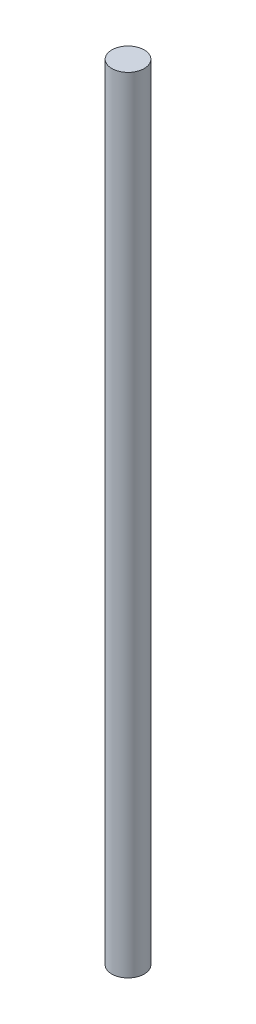
ISO-10303-21;
HEADER;
FILE_DESCRIPTION(('STEP AP214'),'2;1');
FILE_NAME('part.step','',(''),(''),'','','');
FILE_SCHEMA(('AUTOMOTIVE_DESIGN { 1 0 10303 214 1 1 1 1 }'));
ENDSEC;
DATA;
#1=APPLICATION_CONTEXT('core data for automotive mechanical design processes');
#2=APPLICATION_PROTOCOL_DEFINITION('international standard','automotive_design',2000,#1);
#3=PRODUCT_CONTEXT('',#1,'mechanical');
#4=PRODUCT('Part','Part','',(#3));
#5=PRODUCT_RELATED_PRODUCT_CATEGORY('part','',(#4));
#6=PRODUCT_DEFINITION_FORMATION('','',#4);
#7=PRODUCT_DEFINITION_CONTEXT('part definition',#1,'design');
#8=PRODUCT_DEFINITION('design','',#6,#7);
#9=PRODUCT_DEFINITION_SHAPE('','',#8);
#10=(LENGTH_UNIT() NAMED_UNIT(*) SI_UNIT(.MILLI.,.METRE.));
#11=(NAMED_UNIT(*) PLANE_ANGLE_UNIT() SI_UNIT($,.RADIAN.));
#12=(NAMED_UNIT(*) SI_UNIT($,.STERADIAN.) SOLID_ANGLE_UNIT());
#13=UNCERTAINTY_MEASURE_WITH_UNIT(LENGTH_MEASURE(1.E-05),#10,'distance_accuracy_value','');
#14=(GEOMETRIC_REPRESENTATION_CONTEXT(3) GLOBAL_UNCERTAINTY_ASSIGNED_CONTEXT((#13)) GLOBAL_UNIT_ASSIGNED_CONTEXT((#10,
#11,#12)) REPRESENTATION_CONTEXT('',''));
#15=CARTESIAN_POINT('',(0.,0.,0.));
#16=DIRECTION('',(0.,0.,1.));
#17=DIRECTION('',(1.,0.,0.));
#18=AXIS2_PLACEMENT_3D('',#15,#16,#17);
#19=CARTESIAN_POINT('',(0.,194.,0.));
#20=DIRECTION('',(0.,-1.,0.));
#21=DIRECTION('',(0.,0.,-1.));
#22=AXIS2_PLACEMENT_3D('',#19,#20,#21);
#23=CYLINDRICAL_SURFACE('',#22,4.);
#24=CARTESIAN_POINT('',(0.,194.,0.));
#25=DIRECTION('',(0.,1.,0.));
#26=DIRECTION('',(0.,0.,1.));
#27=AXIS2_PLACEMENT_3D('',#24,#25,#26);
#28=CIRCLE('',#27,4.);
#29=CARTESIAN_POINT('',(0.,194.,-4.));
#30=VERTEX_POINT('',#29);
#31=EDGE_CURVE('E10',#30,#30,#28,.T.);
#32=CARTESIAN_POINT('',(0.,0.,0.));
#33=DIRECTION('',(0.,1.,0.));
#34=DIRECTION('',(0.,0.,1.));
#35=AXIS2_PLACEMENT_3D('',#32,#33,#34);
#36=CIRCLE('',#35,4.);
#37=CARTESIAN_POINT('',(0.,0.,-4.));
#38=VERTEX_POINT('',#37);
#39=EDGE_CURVE('E40',#38,#38,#36,.T.);
#40=CARTESIAN_POINT('',(0.,194.,-4.));
#41=CARTESIAN_POINT('',(0.,191.979166666667,-4.));
#42=CARTESIAN_POINT('',(0.,189.958333333333,-4.));
#43=CARTESIAN_POINT('',(0.,185.916666666667,-4.));
#44=CARTESIAN_POINT('',(0.,183.895833333333,-4.));
#45=CARTESIAN_POINT('',(0.,179.854166666667,-4.));
#46=CARTESIAN_POINT('',(0.,177.833333333333,-4.));
#47=CARTESIAN_POINT('',(0.,173.791666666667,-4.));
#48=CARTESIAN_POINT('',(0.,171.770833333333,-4.));
#49=CARTESIAN_POINT('',(0.,167.729166666667,-4.));
#50=CARTESIAN_POINT('',(0.,165.708333333333,-4.));
#51=CARTESIAN_POINT('',(0.,161.666666666667,-4.));
#52=CARTESIAN_POINT('',(0.,159.645833333333,-4.));
#53=CARTESIAN_POINT('',(0.,155.604166666667,-4.));
#54=CARTESIAN_POINT('',(0.,153.583333333333,-4.));
#55=CARTESIAN_POINT('',(0.,149.541666666667,-4.));
#56=CARTESIAN_POINT('',(0.,147.520833333333,-4.));
#57=CARTESIAN_POINT('',(0.,143.479166666667,-4.));
#58=CARTESIAN_POINT('',(0.,141.458333333333,-4.));
#59=CARTESIAN_POINT('',(0.,137.416666666667,-4.));
#60=CARTESIAN_POINT('',(0.,135.395833333333,-4.));
#61=CARTESIAN_POINT('',(0.,131.354166666667,-4.));
#62=CARTESIAN_POINT('',(0.,129.333333333333,-4.));
#63=CARTESIAN_POINT('',(0.,125.291666666667,-4.));
#64=CARTESIAN_POINT('',(0.,123.270833333333,-4.));
#65=CARTESIAN_POINT('',(0.,119.229166666667,-4.));
#66=CARTESIAN_POINT('',(0.,117.208333333333,-4.));
#67=CARTESIAN_POINT('',(0.,113.166666666667,-4.));
#68=CARTESIAN_POINT('',(0.,111.145833333333,-4.));
#69=CARTESIAN_POINT('',(0.,107.104166666667,-4.));
#70=CARTESIAN_POINT('',(0.,105.083333333333,-4.));
#71=CARTESIAN_POINT('',(0.,101.041666666667,-4.));
#72=CARTESIAN_POINT('',(0.,99.0208333333333,-4.));
#73=CARTESIAN_POINT('',(0.,94.9791666666667,-4.));
#74=CARTESIAN_POINT('',(0.,92.9583333333333,-4.));
#75=CARTESIAN_POINT('',(0.,88.9166666666667,-4.));
#76=CARTESIAN_POINT('',(0.,86.8958333333333,-4.));
#77=CARTESIAN_POINT('',(0.,82.8541666666667,-4.));
#78=CARTESIAN_POINT('',(0.,80.8333333333333,-4.));
#79=CARTESIAN_POINT('',(0.,76.7916666666666,-4.));
#80=CARTESIAN_POINT('',(0.,74.7708333333333,-4.));
#81=CARTESIAN_POINT('',(0.,70.7291666666666,-4.));
#82=CARTESIAN_POINT('',(0.,68.7083333333333,-4.));
#83=CARTESIAN_POINT('',(0.,64.6666666666667,-4.));
#84=CARTESIAN_POINT('',(0.,62.6458333333333,-4.));
#85=CARTESIAN_POINT('',(0.,58.6041666666667,-4.));
#86=CARTESIAN_POINT('',(0.,56.5833333333333,-4.));
#87=CARTESIAN_POINT('',(0.,52.5416666666667,-4.));
#88=CARTESIAN_POINT('',(0.,50.5208333333333,-4.));
#89=CARTESIAN_POINT('',(0.,46.4791666666667,-4.));
#90=CARTESIAN_POINT('',(0.,44.4583333333333,-4.));
#91=CARTESIAN_POINT('',(0.,40.4166666666667,-4.));
#92=CARTESIAN_POINT('',(0.,38.3958333333333,-4.));
#93=CARTESIAN_POINT('',(0.,34.3541666666667,-4.));
#94=CARTESIAN_POINT('',(0.,32.3333333333333,-4.));
#95=CARTESIAN_POINT('',(0.,28.2916666666666,-4.));
#96=CARTESIAN_POINT('',(0.,26.2708333333333,-4.));
#97=CARTESIAN_POINT('',(0.,22.2291666666666,-4.));
#98=CARTESIAN_POINT('',(0.,20.2083333333333,-4.));
#99=CARTESIAN_POINT('',(0.,16.1666666666666,-4.));
#100=CARTESIAN_POINT('',(0.,14.1458333333333,-4.));
#101=CARTESIAN_POINT('',(0.,10.1041666666666,-4.));
#102=CARTESIAN_POINT('',(0.,8.0833333333333,-4.));
#103=CARTESIAN_POINT('',(0.,4.04166666666664,-4.));
#104=CARTESIAN_POINT('',(0.,2.02083333333331,-4.));
#105=CARTESIAN_POINT('',(0.,0.,-4.));
#106=B_SPLINE_CURVE_WITH_KNOTS('',3,(#40,#41,#42,#43,#44,#45,#46,#47,#48,#49,#50,#51,#52,#53,
#54,#55,#56,#57,#58,#59,#60,#61,#62,#63,#64,#65,#66,#67,#68,#69,#70,#71,#72,#73,#74,#75,#76,#77,
#78,#79,#80,#81,#82,#83,#84,#85,#86,#87,#88,#89,#90,#91,#92,#93,#94,#95,#96,#97,#98,#99,#100,
#101,#102,#103,#104,#105),.UNSPECIFIED.,.F.,.F.,(4,2,2,2,2,2,2,2,2,2,2,2,2,2,2,2,2,2,2,2,2,2,2,
2,2,2,2,2,2,2,2,2,4),(0.,6.0625,12.125,18.1875,24.25,30.3125,36.375,42.4375,48.5,54.5625,60.625,
66.6875,72.75,78.8125,84.875,90.9375,97.,103.0625,109.125,115.1875,121.25,127.3125,133.375,
139.4375,145.5,151.5625,157.625,163.6875,169.75,175.8125,181.875,187.9375,194.),.UNSPECIFIED.);
#107=EDGE_CURVE('BSEAM37',#30,#38,#106,.T.);
#108=ORIENTED_EDGE('',*,*,#31,.F.);
#109=ORIENTED_EDGE('',*,*,#39,.T.);
#110=ORIENTED_EDGE('',*,*,#107,.T.);
#111=ORIENTED_EDGE('',*,*,#107,.F.);
#112=EDGE_LOOP('',(#108,#110,#109,#111));
#113=FACE_BOUND('',#112,.T.);
#114=ADVANCED_FACE('F37',(#113),#23,.T.);
#115=CARTESIAN_POINT('',(0.,194.,0.));
#116=DIRECTION('',(0.,1.,0.));
#117=DIRECTION('',(0.,0.,1.));
#118=AXIS2_PLACEMENT_3D('',#115,#116,#117);
#119=PLANE('',#118);
#120=ORIENTED_EDGE('',*,*,#31,.T.);
#121=EDGE_LOOP('',(#120));
#122=FACE_BOUND('',#121,.T.);
#123=ADVANCED_FACE('F52',(#122),#119,.T.);
#124=CARTESIAN_POINT('',(0.,0.,0.));
#125=DIRECTION('',(0.,1.,0.));
#126=DIRECTION('',(0.,0.,1.));
#127=AXIS2_PLACEMENT_3D('',#124,#125,#126);
#128=PLANE('',#127);
#129=ORIENTED_EDGE('',*,*,#39,.F.);
#130=EDGE_LOOP('',(#129));
#131=FACE_BOUND('',#130,.T.);
#132=ADVANCED_FACE('F50',(#131),#128,.F.);
#133=CLOSED_SHELL('',(#114,#123,#132));
#134=MANIFOLD_SOLID_BREP('B2',#133);
#135=ADVANCED_BREP_SHAPE_REPRESENTATION('',(#18,#134),#14);
#136=SHAPE_DEFINITION_REPRESENTATION(#9,#135);
ENDSEC;
END-ISO-10303-21;
